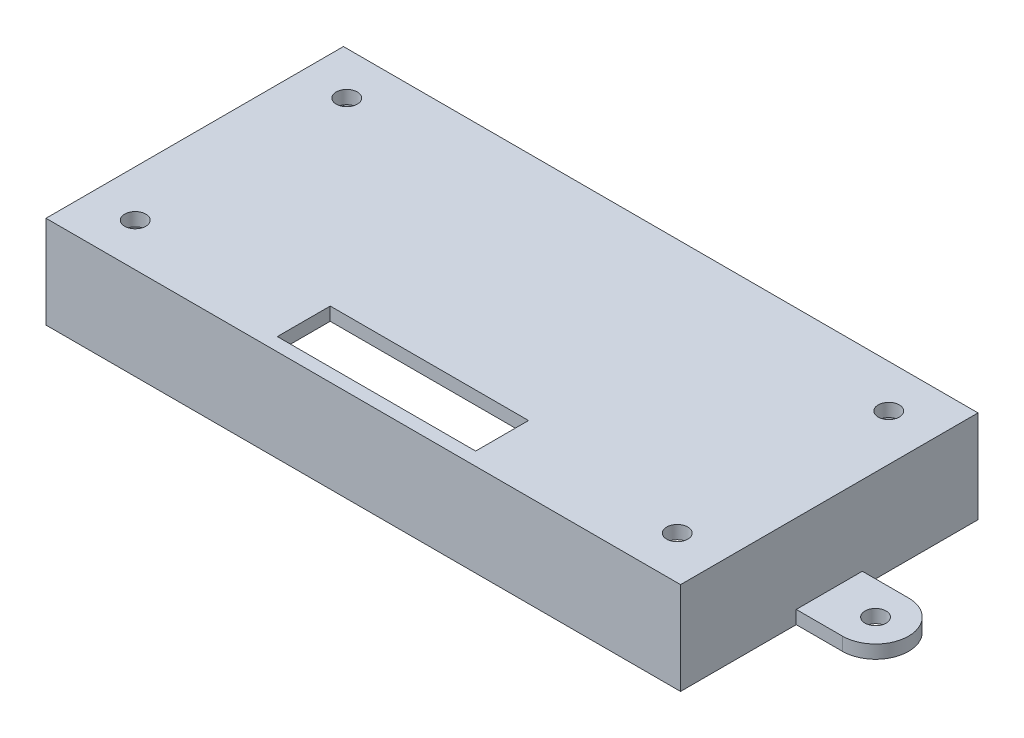
ISO-10303-21;
HEADER;
FILE_DESCRIPTION(('STEP AP214'),'2;1');
FILE_NAME('part.step','',(''),(''),'','','');
FILE_SCHEMA(('AUTOMOTIVE_DESIGN { 1 0 10303 214 1 1 1 1 }'));
ENDSEC;
DATA;
#1=APPLICATION_CONTEXT('core data for automotive mechanical design processes');
#2=APPLICATION_PROTOCOL_DEFINITION('international standard','automotive_design',2000,#1);
#3=PRODUCT_CONTEXT('',#1,'mechanical');
#4=PRODUCT('Part','Part','',(#3));
#5=PRODUCT_RELATED_PRODUCT_CATEGORY('part','',(#4));
#6=PRODUCT_DEFINITION_FORMATION('','',#4);
#7=PRODUCT_DEFINITION_CONTEXT('part definition',#1,'design');
#8=PRODUCT_DEFINITION('design','',#6,#7);
#9=PRODUCT_DEFINITION_SHAPE('','',#8);
#10=(LENGTH_UNIT() NAMED_UNIT(*) SI_UNIT(.MILLI.,.METRE.));
#11=(NAMED_UNIT(*) PLANE_ANGLE_UNIT() SI_UNIT($,.RADIAN.));
#12=(NAMED_UNIT(*) SI_UNIT($,.STERADIAN.) SOLID_ANGLE_UNIT());
#13=UNCERTAINTY_MEASURE_WITH_UNIT(LENGTH_MEASURE(1.E-05),#10,'distance_accuracy_value','');
#14=(GEOMETRIC_REPRESENTATION_CONTEXT(3) GLOBAL_UNCERTAINTY_ASSIGNED_CONTEXT((#13)) GLOBAL_UNIT_ASSIGNED_CONTEXT((#10,
#11,#12)) REPRESENTATION_CONTEXT('',''));
#15=CARTESIAN_POINT('',(0.,0.,0.));
#16=DIRECTION('',(0.,0.,1.));
#17=DIRECTION('',(1.,0.,0.));
#18=AXIS2_PLACEMENT_3D('',#15,#16,#17);
#19=CARTESIAN_POINT('',(0.,2.,0.));
#20=DIRECTION('',(0.,1.,0.));
#21=DIRECTION('',(0.,0.,1.));
#22=AXIS2_PLACEMENT_3D('',#19,#20,#21);
#23=PLANE('',#22);
#24=DIRECTION('',(0.,0.,1.));
#25=VECTOR('',#24,1.);
#26=CARTESIAN_POINT('',(-48.,2.,-22.5));
#27=LINE('',#26,#25);
#28=CARTESIAN_POINT('',(-48.,2.,-5.));
#29=VERTEX_POINT('',#28);
#30=CARTESIAN_POINT('',(-48.,2.,5.));
#31=VERTEX_POINT('',#30);
#32=EDGE_CURVE('E11',#29,#31,#27,.T.);
#33=ORIENTED_EDGE('',*,*,#32,.F.);
#34=DIRECTION('',(1.,0.,0.));
#35=VECTOR('',#34,1.);
#36=CARTESIAN_POINT('',(0.,2.,-5.00000000000002));
#37=LINE('',#36,#35);
#38=CARTESIAN_POINT('',(-55.,2.,-5.));
#39=VERTEX_POINT('',#38);
#40=EDGE_CURVE('E293',#39,#29,#37,.T.);
#41=ORIENTED_EDGE('',*,*,#40,.F.);
#42=CARTESIAN_POINT('',(-55.,2.,0.));
#43=DIRECTION('',(0.,1.,0.));
#44=DIRECTION('',(0.,0.,1.));
#45=AXIS2_PLACEMENT_3D('',#42,#43,#44);
#46=CIRCLE('',#45,5.);
#47=CARTESIAN_POINT('',(-55.,2.,5.));
#48=VERTEX_POINT('',#47);
#49=EDGE_CURVE('E296',#39,#48,#46,.T.);
#50=ORIENTED_EDGE('',*,*,#49,.T.);
#51=DIRECTION('',(1.,0.,0.));
#52=VECTOR('',#51,1.);
#53=CARTESIAN_POINT('',(0.,2.,5.00000000000002));
#54=LINE('',#53,#52);
#55=EDGE_CURVE('E298',#48,#31,#54,.T.);
#56=ORIENTED_EDGE('',*,*,#55,.T.);
#57=EDGE_LOOP('',(#33,#41,#50,#56));
#58=FACE_BOUND('',#57,.T.);
#59=CARTESIAN_POINT('',(-55.,2.,0.));
#60=DIRECTION('',(0.,1.,0.));
#61=DIRECTION('',(0.,0.,1.));
#62=AXIS2_PLACEMENT_3D('',#59,#60,#61);
#63=CIRCLE('',#62,1.6);
#64=CARTESIAN_POINT('',(-55.,2.,1.6));
#65=VERTEX_POINT('',#64);
#66=EDGE_CURVE('E300',#65,#65,#63,.T.);
#67=ORIENTED_EDGE('',*,*,#66,.F.);
#68=EDGE_LOOP('',(#67));
#69=FACE_BOUND('',#68,.T.);
#70=ADVANCED_FACE('F40',(#58,#69),#23,.T.);
#71=CARTESIAN_POINT('',(0.,2.,22.5));
#72=DIRECTION('',(0.,0.,-1.));
#73=DIRECTION('',(-1.,0.,0.));
#74=AXIS2_PLACEMENT_3D('',#71,#72,#73);
#75=PLANE('',#74);
#76=DIRECTION('',(1.,0.,0.));
#77=VECTOR('',#76,1.);
#78=CARTESIAN_POINT('',(0.,0.,22.5));
#79=LINE('',#78,#77);
#80=CARTESIAN_POINT('',(-48.,0.,22.5));
#81=VERTEX_POINT('',#80);
#82=CARTESIAN_POINT('',(48.,0.,22.5));
#83=VERTEX_POINT('',#82);
#84=EDGE_CURVE('E280',#81,#83,#79,.T.);
#85=ORIENTED_EDGE('',*,*,#84,.T.);
#86=DIRECTION('',(0.,-1.,0.));
#87=VECTOR('',#86,1.);
#88=CARTESIAN_POINT('',(48.,2.,22.5));
#89=LINE('',#88,#87);
#90=CARTESIAN_POINT('',(48.,14.,22.5));
#91=VERTEX_POINT('',#90);
#92=EDGE_CURVE('E44',#91,#83,#89,.T.);
#93=ORIENTED_EDGE('',*,*,#92,.F.);
#94=DIRECTION('',(1.,0.,0.));
#95=VECTOR('',#94,1.);
#96=CARTESIAN_POINT('',(-48.,14.,22.5));
#97=LINE('',#96,#95);
#98=CARTESIAN_POINT('',(-48.,14.,22.5));
#99=VERTEX_POINT('',#98);
#100=EDGE_CURVE('E239',#99,#91,#97,.T.);
#101=ORIENTED_EDGE('',*,*,#100,.F.);
#102=DIRECTION('',(0.,-1.,0.));
#103=VECTOR('',#102,1.);
#104=CARTESIAN_POINT('',(-48.,2.,22.5));
#105=LINE('',#104,#103);
#106=EDGE_CURVE('E306',#99,#81,#105,.T.);
#107=ORIENTED_EDGE('',*,*,#106,.T.);
#108=EDGE_LOOP('',(#85,#93,#101,#107));
#109=FACE_BOUND('',#108,.T.);
#110=ADVANCED_FACE('F42',(#109),#75,.F.);
#111=CARTESIAN_POINT('',(0.,2.,5.00000000000011));
#112=DIRECTION('',(0.,0.,1.));
#113=DIRECTION('',(1.,0.,0.));
#114=AXIS2_PLACEMENT_3D('',#111,#112,#113);
#115=PLANE('',#114);
#116=DIRECTION('',(-1.,0.,0.));
#117=VECTOR('',#116,1.);
#118=CARTESIAN_POINT('',(0.,0.,5.00000000000011));
#119=LINE('',#118,#117);
#120=CARTESIAN_POINT('',(55.,0.,5.));
#121=VERTEX_POINT('',#120);
#122=CARTESIAN_POINT('',(48.,0.,5.));
#123=VERTEX_POINT('',#122);
#124=EDGE_CURVE('E312',#121,#123,#119,.T.);
#125=ORIENTED_EDGE('',*,*,#124,.F.);
#126=DIRECTION('',(0.,-1.,0.));
#127=VECTOR('',#126,1.);
#128=CARTESIAN_POINT('',(55.,2.,5.));
#129=LINE('',#128,#127);
#130=CARTESIAN_POINT('',(55.,2.,5.));
#131=VERTEX_POINT('',#130);
#132=EDGE_CURVE('E360',#131,#121,#129,.T.);
#133=ORIENTED_EDGE('',*,*,#132,.F.);
#134=DIRECTION('',(-1.,0.,0.));
#135=VECTOR('',#134,1.);
#136=CARTESIAN_POINT('',(0.,2.,5.00000000000011));
#137=LINE('',#136,#135);
#138=CARTESIAN_POINT('',(48.,2.,5.));
#139=VERTEX_POINT('',#138);
#140=EDGE_CURVE('E284',#131,#139,#137,.T.);
#141=ORIENTED_EDGE('',*,*,#140,.T.);
#142=DIRECTION('',(0.,-1.,0.));
#143=VECTOR('',#142,1.);
#144=CARTESIAN_POINT('',(48.,2.,5.));
#145=LINE('',#144,#143);
#146=EDGE_CURVE('E361',#139,#123,#145,.T.);
#147=ORIENTED_EDGE('',*,*,#146,.T.);
#148=EDGE_LOOP('',(#125,#133,#141,#147));
#149=FACE_BOUND('',#148,.T.);
#150=ADVANCED_FACE('F411',(#149),#115,.T.);
#151=CARTESIAN_POINT('',(55.,2.,0.));
#152=DIRECTION('',(0.,-1.,0.));
#153=DIRECTION('',(0.,0.,-1.));
#154=AXIS2_PLACEMENT_3D('',#151,#152,#153);
#155=CYLINDRICAL_SURFACE('',#154,5.);
#156=CARTESIAN_POINT('',(55.,0.,0.));
#157=DIRECTION('',(0.,1.,0.));
#158=DIRECTION('',(0.,0.,1.));
#159=AXIS2_PLACEMENT_3D('',#156,#157,#158);
#160=CIRCLE('',#159,5.);
#161=CARTESIAN_POINT('',(55.,0.,-5.));
#162=VERTEX_POINT('',#161);
#163=EDGE_CURVE('E316',#162,#121,#160,.F.);
#164=ORIENTED_EDGE('',*,*,#163,.F.);
#165=DIRECTION('',(0.,-1.,0.));
#166=VECTOR('',#165,1.);
#167=CARTESIAN_POINT('',(55.,2.,-5.));
#168=LINE('',#167,#166);
#169=CARTESIAN_POINT('',(55.,2.,-5.));
#170=VERTEX_POINT('',#169);
#171=EDGE_CURVE('E358',#170,#162,#168,.T.);
#172=ORIENTED_EDGE('',*,*,#171,.F.);
#173=CARTESIAN_POINT('',(55.,2.,0.));
#174=DIRECTION('',(0.,1.,0.));
#175=DIRECTION('',(0.,0.,1.));
#176=AXIS2_PLACEMENT_3D('',#173,#174,#175);
#177=CIRCLE('',#176,5.);
#178=EDGE_CURVE('E287',#170,#131,#177,.F.);
#179=ORIENTED_EDGE('',*,*,#178,.T.);
#180=ORIENTED_EDGE('',*,*,#132,.T.);
#181=EDGE_LOOP('',(#164,#172,#179,#180));
#182=FACE_BOUND('',#181,.T.);
#183=ADVANCED_FACE('F409',(#182),#155,.T.);
#184=CARTESIAN_POINT('',(0.,2.,-5.00000000000011));
#185=DIRECTION('',(0.,0.,1.));
#186=DIRECTION('',(1.,0.,0.));
#187=AXIS2_PLACEMENT_3D('',#184,#185,#186);
#188=PLANE('',#187);
#189=DIRECTION('',(-1.,0.,0.));
#190=VECTOR('',#189,1.);
#191=CARTESIAN_POINT('',(0.,0.,-5.00000000000011));
#192=LINE('',#191,#190);
#193=CARTESIAN_POINT('',(48.,0.,-5.));
#194=VERTEX_POINT('',#193);
#195=EDGE_CURVE('E319',#162,#194,#192,.T.);
#196=ORIENTED_EDGE('',*,*,#195,.T.);
#197=DIRECTION('',(0.,-1.,0.));
#198=VECTOR('',#197,1.);
#199=CARTESIAN_POINT('',(48.,2.,-5.));
#200=LINE('',#199,#198);
#201=CARTESIAN_POINT('',(48.,2.,-5.));
#202=VERTEX_POINT('',#201);
#203=EDGE_CURVE('E355',#202,#194,#200,.T.);
#204=ORIENTED_EDGE('',*,*,#203,.F.);
#205=DIRECTION('',(-1.,0.,0.));
#206=VECTOR('',#205,1.);
#207=CARTESIAN_POINT('',(0.,2.,-5.00000000000011));
#208=LINE('',#207,#206);
#209=EDGE_CURVE('E291',#170,#202,#208,.T.);
#210=ORIENTED_EDGE('',*,*,#209,.F.);
#211=ORIENTED_EDGE('',*,*,#171,.T.);
#212=EDGE_LOOP('',(#196,#204,#210,#211));
#213=FACE_BOUND('',#212,.T.);
#214=ADVANCED_FACE('F405',(#213),#188,.F.);
#215=CARTESIAN_POINT('',(48.,2.,0.));
#216=DIRECTION('',(-1.,0.,0.));
#217=DIRECTION('',(0.,0.,1.));
#218=AXIS2_PLACEMENT_3D('',#215,#216,#217);
#219=PLANE('',#218);
#220=DIRECTION('',(0.,0.,-1.));
#221=VECTOR('',#220,1.);
#222=CARTESIAN_POINT('',(48.,0.,0.));
#223=LINE('',#222,#221);
#224=CARTESIAN_POINT('',(48.,0.,-22.5));
#225=VERTEX_POINT('',#224);
#226=EDGE_CURVE('E313',#194,#225,#223,.T.);
#227=ORIENTED_EDGE('',*,*,#226,.T.);
#228=DIRECTION('',(0.,-1.,0.));
#229=VECTOR('',#228,1.);
#230=CARTESIAN_POINT('',(48.,2.,-22.5));
#231=LINE('',#230,#229);
#232=CARTESIAN_POINT('',(48.,14.,-22.5));
#233=VERTEX_POINT('',#232);
#234=EDGE_CURVE('E353',#233,#225,#231,.T.);
#235=ORIENTED_EDGE('',*,*,#234,.F.);
#236=DIRECTION('',(0.,0.,-1.));
#237=VECTOR('',#236,1.);
#238=CARTESIAN_POINT('',(48.,14.,-22.5));
#239=LINE('',#238,#237);
#240=EDGE_CURVE('E242',#91,#233,#239,.T.);
#241=ORIENTED_EDGE('',*,*,#240,.F.);
#242=ORIENTED_EDGE('',*,*,#92,.T.);
#243=EDGE_CURVE('E309',#83,#123,#223,.T.);
#244=ORIENTED_EDGE('',*,*,#243,.T.);
#245=ORIENTED_EDGE('',*,*,#146,.F.);
#246=DIRECTION('',(0.,0.,-1.));
#247=VECTOR('',#246,1.);
#248=CARTESIAN_POINT('',(48.,2.,-22.5));
#249=LINE('',#248,#247);
#250=EDGE_CURVE('E49',#139,#202,#249,.T.);
#251=ORIENTED_EDGE('',*,*,#250,.T.);
#252=ORIENTED_EDGE('',*,*,#203,.T.);
#253=EDGE_LOOP('',(#227,#235,#241,#242,#244,#245,#251,#252));
#254=FACE_BOUND('',#253,.T.);
#255=ADVANCED_FACE('F369',(#254),#219,.F.);
#256=CARTESIAN_POINT('',(0.,2.,-22.5));
#257=DIRECTION('',(0.,0.,-1.));
#258=DIRECTION('',(-1.,0.,0.));
#259=AXIS2_PLACEMENT_3D('',#256,#257,#258);
#260=PLANE('',#259);
#261=DIRECTION('',(1.,0.,0.));
#262=VECTOR('',#261,1.);
#263=CARTESIAN_POINT('',(0.,0.,-22.5));
#264=LINE('',#263,#262);
#265=CARTESIAN_POINT('',(-48.,0.,-22.5));
#266=VERTEX_POINT('',#265);
#267=EDGE_CURVE('E321',#266,#225,#264,.T.);
#268=ORIENTED_EDGE('',*,*,#267,.F.);
#269=DIRECTION('',(0.,-1.,0.));
#270=VECTOR('',#269,1.);
#271=CARTESIAN_POINT('',(-48.,2.,-22.5));
#272=LINE('',#271,#270);
#273=CARTESIAN_POINT('',(-48.,14.,-22.5));
#274=VERTEX_POINT('',#273);
#275=EDGE_CURVE('E351',#274,#266,#272,.T.);
#276=ORIENTED_EDGE('',*,*,#275,.F.);
#277=DIRECTION('',(-1.,0.,0.));
#278=VECTOR('',#277,1.);
#279=CARTESIAN_POINT('',(-48.,14.,-22.5));
#280=LINE('',#279,#278);
#281=EDGE_CURVE('E245',#233,#274,#280,.T.);
#282=ORIENTED_EDGE('',*,*,#281,.F.);
#283=ORIENTED_EDGE('',*,*,#234,.T.);
#284=EDGE_LOOP('',(#268,#276,#282,#283));
#285=FACE_BOUND('',#284,.T.);
#286=ADVANCED_FACE('F400',(#285),#260,.T.);
#287=CARTESIAN_POINT('',(0.,2.,-5.00000000000002));
#288=DIRECTION('',(0.,0.,-1.));
#289=DIRECTION('',(-1.,0.,0.));
#290=AXIS2_PLACEMENT_3D('',#287,#288,#289);
#291=PLANE('',#290);
#292=DIRECTION('',(1.,0.,0.));
#293=VECTOR('',#292,1.);
#294=CARTESIAN_POINT('',(0.,0.,-5.00000000000002));
#295=LINE('',#294,#293);
#296=CARTESIAN_POINT('',(-55.,0.,-5.));
#297=VERTEX_POINT('',#296);
#298=CARTESIAN_POINT('',(-48.,0.,-5.));
#299=VERTEX_POINT('',#298);
#300=EDGE_CURVE('E327',#297,#299,#295,.T.);
#301=ORIENTED_EDGE('',*,*,#300,.F.);
#302=DIRECTION('',(0.,-1.,0.));
#303=VECTOR('',#302,1.);
#304=CARTESIAN_POINT('',(-55.,2.,-5.));
#305=LINE('',#304,#303);
#306=EDGE_CURVE('E347',#39,#297,#305,.T.);
#307=ORIENTED_EDGE('',*,*,#306,.F.);
#308=ORIENTED_EDGE('',*,*,#40,.T.);
#309=DIRECTION('',(0.,-1.,0.));
#310=VECTOR('',#309,1.);
#311=CARTESIAN_POINT('',(-48.,2.,-5.));
#312=LINE('',#311,#310);
#313=EDGE_CURVE('E349',#29,#299,#312,.T.);
#314=ORIENTED_EDGE('',*,*,#313,.T.);
#315=EDGE_LOOP('',(#301,#307,#308,#314));
#316=FACE_BOUND('',#315,.T.);
#317=ADVANCED_FACE('F392',(#316),#291,.T.);
#318=CARTESIAN_POINT('',(-55.,2.,0.));
#319=DIRECTION('',(0.,-1.,0.));
#320=DIRECTION('',(0.,0.,-1.));
#321=AXIS2_PLACEMENT_3D('',#318,#319,#320);
#322=CYLINDRICAL_SURFACE('',#321,5.);
#323=CARTESIAN_POINT('',(-55.,0.,0.));
#324=DIRECTION('',(0.,1.,0.));
#325=DIRECTION('',(0.,0.,1.));
#326=AXIS2_PLACEMENT_3D('',#323,#324,#325);
#327=CIRCLE('',#326,5.);
#328=CARTESIAN_POINT('',(-55.,0.,5.));
#329=VERTEX_POINT('',#328);
#330=EDGE_CURVE('E331',#297,#329,#327,.T.);
#331=ORIENTED_EDGE('',*,*,#330,.T.);
#332=DIRECTION('',(0.,-1.,0.));
#333=VECTOR('',#332,1.);
#334=CARTESIAN_POINT('',(-55.,2.,5.));
#335=LINE('',#334,#333);
#336=EDGE_CURVE('E344',#48,#329,#335,.T.);
#337=ORIENTED_EDGE('',*,*,#336,.F.);
#338=ORIENTED_EDGE('',*,*,#49,.F.);
#339=ORIENTED_EDGE('',*,*,#306,.T.);
#340=EDGE_LOOP('',(#331,#337,#338,#339));
#341=FACE_BOUND('',#340,.T.);
#342=ADVANCED_FACE('F454',(#341),#322,.T.);
#343=CARTESIAN_POINT('',(0.,2.,5.00000000000002));
#344=DIRECTION('',(0.,0.,-1.));
#345=DIRECTION('',(-1.,0.,0.));
#346=AXIS2_PLACEMENT_3D('',#343,#344,#345);
#347=PLANE('',#346);
#348=DIRECTION('',(1.,0.,0.));
#349=VECTOR('',#348,1.);
#350=CARTESIAN_POINT('',(0.,0.,5.00000000000002));
#351=LINE('',#350,#349);
#352=CARTESIAN_POINT('',(-48.,0.,5.));
#353=VERTEX_POINT('',#352);
#354=EDGE_CURVE('E333',#329,#353,#351,.T.);
#355=ORIENTED_EDGE('',*,*,#354,.T.);
#356=DIRECTION('',(0.,-1.,0.));
#357=VECTOR('',#356,1.);
#358=CARTESIAN_POINT('',(-48.,2.,5.));
#359=LINE('',#358,#357);
#360=EDGE_CURVE('E342',#31,#353,#359,.T.);
#361=ORIENTED_EDGE('',*,*,#360,.F.);
#362=ORIENTED_EDGE('',*,*,#55,.F.);
#363=ORIENTED_EDGE('',*,*,#336,.T.);
#364=EDGE_LOOP('',(#355,#361,#362,#363));
#365=FACE_BOUND('',#364,.T.);
#366=ADVANCED_FACE('F386',(#365),#347,.F.);
#367=CARTESIAN_POINT('',(-55.,2.,0.));
#368=DIRECTION('',(0.,-1.,0.));
#369=DIRECTION('',(0.,0.,-1.));
#370=AXIS2_PLACEMENT_3D('',#367,#368,#369);
#371=CYLINDRICAL_SURFACE('',#370,1.6);
#372=ORIENTED_EDGE('',*,*,#66,.T.);
#373=EDGE_LOOP('',(#372));
#374=FACE_BOUND('',#373,.T.);
#375=CARTESIAN_POINT('',(-55.,0.,0.));
#376=DIRECTION('',(0.,1.,0.));
#377=DIRECTION('',(0.,0.,1.));
#378=AXIS2_PLACEMENT_3D('',#375,#376,#377);
#379=CIRCLE('',#378,1.6);
#380=CARTESIAN_POINT('',(-55.,0.,1.6));
#381=VERTEX_POINT('',#380);
#382=EDGE_CURVE('E336',#381,#381,#379,.T.);
#383=ORIENTED_EDGE('',*,*,#382,.F.);
#384=EDGE_LOOP('',(#383));
#385=FACE_BOUND('',#384,.T.);
#386=ADVANCED_FACE('F446',(#374,#385),#371,.F.);
#387=CARTESIAN_POINT('',(-48.,2.,0.));
#388=DIRECTION('',(-1.,0.,0.));
#389=DIRECTION('',(0.,0.,1.));
#390=AXIS2_PLACEMENT_3D('',#387,#388,#389);
#391=PLANE('',#390);
#392=DIRECTION('',(0.,0.,-1.));
#393=VECTOR('',#392,1.);
#394=CARTESIAN_POINT('',(-48.,0.,0.));
#395=LINE('',#394,#393);
#396=EDGE_CURVE('E328',#81,#353,#395,.T.);
#397=ORIENTED_EDGE('',*,*,#396,.F.);
#398=ORIENTED_EDGE('',*,*,#106,.F.);
#399=DIRECTION('',(0.,0.,1.));
#400=VECTOR('',#399,1.);
#401=CARTESIAN_POINT('',(-48.,14.,-22.5));
#402=LINE('',#401,#400);
#403=EDGE_CURVE('E234',#274,#99,#402,.T.);
#404=ORIENTED_EDGE('',*,*,#403,.F.);
#405=ORIENTED_EDGE('',*,*,#275,.T.);
#406=EDGE_CURVE('E324',#299,#266,#395,.T.);
#407=ORIENTED_EDGE('',*,*,#406,.F.);
#408=ORIENTED_EDGE('',*,*,#313,.F.);
#409=ORIENTED_EDGE('',*,*,#32,.T.);
#410=ORIENTED_EDGE('',*,*,#360,.T.);
#411=EDGE_LOOP('',(#397,#398,#404,#405,#407,#408,#409,#410));
#412=FACE_BOUND('',#411,.T.);
#413=ADVANCED_FACE('F380',(#412),#391,.T.);
#414=CARTESIAN_POINT('',(55.,2.,0.));
#415=DIRECTION('',(0.,-1.,0.));
#416=DIRECTION('',(0.,0.,-1.));
#417=AXIS2_PLACEMENT_3D('',#414,#415,#416);
#418=CYLINDRICAL_SURFACE('',#417,1.6);
#419=CARTESIAN_POINT('',(55.,2.,0.));
#420=DIRECTION('',(0.,1.,0.));
#421=DIRECTION('',(0.,0.,1.));
#422=AXIS2_PLACEMENT_3D('',#419,#420,#421);
#423=CIRCLE('',#422,1.6);
#424=CARTESIAN_POINT('',(55.,2.,1.6));
#425=VERTEX_POINT('',#424);
#426=EDGE_CURVE('E303',#425,#425,#423,.F.);
#427=ORIENTED_EDGE('',*,*,#426,.F.);
#428=EDGE_LOOP('',(#427));
#429=FACE_BOUND('',#428,.T.);
#430=CARTESIAN_POINT('',(55.,0.,0.));
#431=DIRECTION('',(0.,1.,0.));
#432=DIRECTION('',(0.,0.,1.));
#433=AXIS2_PLACEMENT_3D('',#430,#431,#432);
#434=CIRCLE('',#433,1.6);
#435=CARTESIAN_POINT('',(55.,0.,1.6));
#436=VERTEX_POINT('',#435);
#437=EDGE_CURVE('E288',#436,#436,#434,.F.);
#438=ORIENTED_EDGE('',*,*,#437,.T.);
#439=EDGE_LOOP('',(#438));
#440=FACE_BOUND('',#439,.T.);
#441=ADVANCED_FACE('F428',(#429,#440),#418,.F.);
#442=ORIENTED_EDGE('',*,*,#250,.F.);
#443=ORIENTED_EDGE('',*,*,#140,.F.);
#444=ORIENTED_EDGE('',*,*,#178,.F.);
#445=ORIENTED_EDGE('',*,*,#209,.T.);
#446=EDGE_LOOP('',(#442,#443,#444,#445));
#447=FACE_BOUND('',#446,.T.);
#448=ORIENTED_EDGE('',*,*,#426,.T.);
#449=EDGE_LOOP('',(#448));
#450=FACE_BOUND('',#449,.T.);
#451=ADVANCED_FACE('F421',(#447,#450),#23,.T.);
#452=CARTESIAN_POINT('',(0.,0.,0.));
#453=DIRECTION('',(0.,1.,0.));
#454=DIRECTION('',(0.,0.,1.));
#455=AXIS2_PLACEMENT_3D('',#452,#453,#454);
#456=PLANE('',#455);
#457=DIRECTION('',(-1.,0.,0.));
#458=VECTOR('',#457,1.);
#459=CARTESIAN_POINT('',(-46.,0.,-20.5));
#460=LINE('',#459,#458);
#461=CARTESIAN_POINT('',(46.,0.,-20.5));
#462=VERTEX_POINT('',#461);
#463=CARTESIAN_POINT('',(-46.,0.,-20.5));
#464=VERTEX_POINT('',#463);
#465=EDGE_CURVE('E257',#462,#464,#460,.T.);
#466=ORIENTED_EDGE('',*,*,#465,.T.);
#467=DIRECTION('',(0.,0.,1.));
#468=VECTOR('',#467,1.);
#469=CARTESIAN_POINT('',(-46.,0.,20.5));
#470=LINE('',#469,#468);
#471=CARTESIAN_POINT('',(-46.,0.,20.5));
#472=VERTEX_POINT('',#471);
#473=EDGE_CURVE('E248',#464,#472,#470,.T.);
#474=ORIENTED_EDGE('',*,*,#473,.T.);
#475=DIRECTION('',(1.,0.,0.));
#476=VECTOR('',#475,1.);
#477=CARTESIAN_POINT('',(-46.,0.,20.5));
#478=LINE('',#477,#476);
#479=CARTESIAN_POINT('',(46.,0.,20.5));
#480=VERTEX_POINT('',#479);
#481=EDGE_CURVE('E251',#472,#480,#478,.T.);
#482=ORIENTED_EDGE('',*,*,#481,.T.);
#483=DIRECTION('',(0.,0.,-1.));
#484=VECTOR('',#483,1.);
#485=CARTESIAN_POINT('',(46.,0.,20.5));
#486=LINE('',#485,#484);
#487=EDGE_CURVE('E254',#480,#462,#486,.T.);
#488=ORIENTED_EDGE('',*,*,#487,.T.);
#489=EDGE_LOOP('',(#466,#474,#482,#488));
#490=FACE_BOUND('',#489,.T.);
#491=ORIENTED_EDGE('',*,*,#84,.F.);
#492=ORIENTED_EDGE('',*,*,#396,.T.);
#493=ORIENTED_EDGE('',*,*,#354,.F.);
#494=ORIENTED_EDGE('',*,*,#330,.F.);
#495=ORIENTED_EDGE('',*,*,#300,.T.);
#496=ORIENTED_EDGE('',*,*,#406,.T.);
#497=ORIENTED_EDGE('',*,*,#267,.T.);
#498=ORIENTED_EDGE('',*,*,#226,.F.);
#499=ORIENTED_EDGE('',*,*,#195,.F.);
#500=ORIENTED_EDGE('',*,*,#163,.T.);
#501=ORIENTED_EDGE('',*,*,#124,.T.);
#502=ORIENTED_EDGE('',*,*,#243,.F.);
#503=EDGE_LOOP('',(#491,#492,#493,#494,#495,#496,#497,#498,#499,#500,#501,#502));
#504=FACE_BOUND('',#503,.T.);
#505=ORIENTED_EDGE('',*,*,#382,.T.);
#506=EDGE_LOOP('',(#505));
#507=FACE_BOUND('',#506,.T.);
#508=ORIENTED_EDGE('',*,*,#437,.F.);
#509=EDGE_LOOP('',(#508));
#510=FACE_BOUND('',#509,.T.);
#511=ADVANCED_FACE('F376',(#490,#504,#507,#510),#456,.F.);
#512=CARTESIAN_POINT('',(-46.,12.,-20.5));
#513=DIRECTION('',(0.,0.,1.));
#514=DIRECTION('',(1.,0.,0.));
#515=AXIS2_PLACEMENT_3D('',#512,#513,#514);
#516=PLANE('',#515);
#517=DIRECTION('',(0.,-1.,0.));
#518=VECTOR('',#517,1.);
#519=CARTESIAN_POINT('',(-46.,12.,-20.5));
#520=LINE('',#519,#518);
#521=CARTESIAN_POINT('',(-46.,12.,-20.5));
#522=VERTEX_POINT('',#521);
#523=EDGE_CURVE('E279',#522,#464,#520,.T.);
#524=ORIENTED_EDGE('',*,*,#523,.T.);
#525=ORIENTED_EDGE('',*,*,#465,.F.);
#526=DIRECTION('',(0.,-1.,0.));
#527=VECTOR('',#526,1.);
#528=CARTESIAN_POINT('',(46.,12.,-20.5));
#529=LINE('',#528,#527);
#530=CARTESIAN_POINT('',(46.,12.,-20.5));
#531=VERTEX_POINT('',#530);
#532=EDGE_CURVE('E273',#531,#462,#529,.T.);
#533=ORIENTED_EDGE('',*,*,#532,.F.);
#534=DIRECTION('',(-1.,0.,0.));
#535=VECTOR('',#534,1.);
#536=CARTESIAN_POINT('',(-46.,12.,-20.5));
#537=LINE('',#536,#535);
#538=EDGE_CURVE('E260',#531,#522,#537,.T.);
#539=ORIENTED_EDGE('',*,*,#538,.T.);
#540=EDGE_LOOP('',(#524,#525,#533,#539));
#541=FACE_BOUND('',#540,.T.);
#542=ADVANCED_FACE('F434',(#541),#516,.T.);
#543=CARTESIAN_POINT('',(-46.,12.,-20.5));
#544=DIRECTION('',(1.,0.,0.));
#545=DIRECTION('',(0.,0.,-1.));
#546=AXIS2_PLACEMENT_3D('',#543,#544,#545);
#547=PLANE('',#546);
#548=DIRECTION('',(0.,-1.,0.));
#549=VECTOR('',#548,1.);
#550=CARTESIAN_POINT('',(-46.,12.,20.5));
#551=LINE('',#550,#549);
#552=CARTESIAN_POINT('',(-46.,12.,20.5));
#553=VERTEX_POINT('',#552);
#554=EDGE_CURVE('E277',#553,#472,#551,.T.);
#555=ORIENTED_EDGE('',*,*,#554,.T.);
#556=ORIENTED_EDGE('',*,*,#473,.F.);
#557=ORIENTED_EDGE('',*,*,#523,.F.);
#558=DIRECTION('',(0.,0.,1.));
#559=VECTOR('',#558,1.);
#560=CARTESIAN_POINT('',(-46.,12.,-20.5));
#561=LINE('',#560,#559);
#562=EDGE_CURVE('E263',#522,#553,#561,.T.);
#563=ORIENTED_EDGE('',*,*,#562,.T.);
#564=EDGE_LOOP('',(#555,#556,#557,#563));
#565=FACE_BOUND('',#564,.T.);
#566=ADVANCED_FACE('F508',(#565),#547,.T.);
#567=CARTESIAN_POINT('',(-46.,12.,20.5));
#568=DIRECTION('',(0.,0.,-1.));
#569=DIRECTION('',(-1.,0.,0.));
#570=AXIS2_PLACEMENT_3D('',#567,#568,#569);
#571=PLANE('',#570);
#572=DIRECTION('',(0.,-1.,0.));
#573=VECTOR('',#572,1.);
#574=CARTESIAN_POINT('',(46.,12.,20.5));
#575=LINE('',#574,#573);
#576=CARTESIAN_POINT('',(46.,12.,20.5));
#577=VERTEX_POINT('',#576);
#578=EDGE_CURVE('E275',#577,#480,#575,.T.);
#579=ORIENTED_EDGE('',*,*,#578,.T.);
#580=ORIENTED_EDGE('',*,*,#481,.F.);
#581=ORIENTED_EDGE('',*,*,#554,.F.);
#582=DIRECTION('',(1.,0.,0.));
#583=VECTOR('',#582,1.);
#584=CARTESIAN_POINT('',(-46.,12.,20.5));
#585=LINE('',#584,#583);
#586=CARTESIAN_POINT('',(-15.,12.,20.5));
#587=VERTEX_POINT('',#586);
#588=EDGE_CURVE('E267',#553,#587,#585,.T.);
#589=ORIENTED_EDGE('',*,*,#588,.T.);
#590=DIRECTION('',(0.,-1.,0.));
#591=VECTOR('',#590,1.);
#592=CARTESIAN_POINT('',(-15.,14.,20.5));
#593=LINE('',#592,#591);
#594=CARTESIAN_POINT('',(-15.,14.,20.5));
#595=VERTEX_POINT('',#594);
#596=EDGE_CURVE('E207',#595,#587,#593,.T.);
#597=ORIENTED_EDGE('',*,*,#596,.F.);
#598=DIRECTION('',(-1.,0.,0.));
#599=VECTOR('',#598,1.);
#600=CARTESIAN_POINT('',(-15.,14.,20.5));
#601=LINE('',#600,#599);
#602=CARTESIAN_POINT('',(15.,14.,20.5));
#603=VERTEX_POINT('',#602);
#604=EDGE_CURVE('E187',#603,#595,#601,.T.);
#605=ORIENTED_EDGE('',*,*,#604,.F.);
#606=DIRECTION('',(0.,-1.,0.));
#607=VECTOR('',#606,1.);
#608=CARTESIAN_POINT('',(15.,14.,20.5));
#609=LINE('',#608,#607);
#610=CARTESIAN_POINT('',(15.,12.,20.5));
#611=VERTEX_POINT('',#610);
#612=EDGE_CURVE('E210',#603,#611,#609,.T.);
#613=ORIENTED_EDGE('',*,*,#612,.T.);
#614=EDGE_CURVE('E266',#611,#577,#585,.T.);
#615=ORIENTED_EDGE('',*,*,#614,.T.);
#616=EDGE_LOOP('',(#579,#580,#581,#589,#597,#605,#613,#615));
#617=FACE_BOUND('',#616,.T.);
#618=ADVANCED_FACE('F519',(#617),#571,.T.);
#619=CARTESIAN_POINT('',(46.,12.,-20.5));
#620=DIRECTION('',(-1.,0.,0.));
#621=DIRECTION('',(0.,0.,1.));
#622=AXIS2_PLACEMENT_3D('',#619,#620,#621);
#623=PLANE('',#622);
#624=ORIENTED_EDGE('',*,*,#532,.T.);
#625=ORIENTED_EDGE('',*,*,#487,.F.);
#626=ORIENTED_EDGE('',*,*,#578,.F.);
#627=DIRECTION('',(0.,0.,-1.));
#628=VECTOR('',#627,1.);
#629=CARTESIAN_POINT('',(46.,12.,-20.5));
#630=LINE('',#629,#628);
#631=EDGE_CURVE('E270',#577,#531,#630,.T.);
#632=ORIENTED_EDGE('',*,*,#631,.T.);
#633=EDGE_LOOP('',(#624,#625,#626,#632));
#634=FACE_BOUND('',#633,.T.);
#635=ADVANCED_FACE('F528',(#634),#623,.T.);
#636=CARTESIAN_POINT('',(0.,12.,0.));
#637=DIRECTION('',(0.,1.,0.));
#638=DIRECTION('',(0.,0.,1.));
#639=AXIS2_PLACEMENT_3D('',#636,#637,#638);
#640=PLANE('',#639);
#641=CARTESIAN_POINT('',(41.,12.,16.));
#642=DIRECTION('',(0.,-1.,0.));
#643=DIRECTION('',(0.,0.,-1.));
#644=AXIS2_PLACEMENT_3D('',#641,#642,#643);
#645=CIRCLE('',#644,1.6);
#646=CARTESIAN_POINT('',(41.,12.,14.4));
#647=VERTEX_POINT('',#646);
#648=EDGE_CURVE('E209',#647,#647,#645,.T.);
#649=ORIENTED_EDGE('',*,*,#648,.F.);
#650=EDGE_LOOP('',(#649));
#651=FACE_BOUND('',#650,.T.);
#652=CARTESIAN_POINT('',(41.,12.,-16.));
#653=DIRECTION('',(0.,-1.,0.));
#654=DIRECTION('',(0.,0.,-1.));
#655=AXIS2_PLACEMENT_3D('',#652,#653,#654);
#656=CIRCLE('',#655,1.6);
#657=CARTESIAN_POINT('',(41.,12.,-17.6));
#658=VERTEX_POINT('',#657);
#659=EDGE_CURVE('E223',#658,#658,#656,.T.);
#660=ORIENTED_EDGE('',*,*,#659,.F.);
#661=EDGE_LOOP('',(#660));
#662=FACE_BOUND('',#661,.T.);
#663=CARTESIAN_POINT('',(-41.,12.,-16.));
#664=DIRECTION('',(0.,-1.,0.));
#665=DIRECTION('',(0.,0.,-1.));
#666=AXIS2_PLACEMENT_3D('',#663,#664,#665);
#667=CIRCLE('',#666,1.6);
#668=CARTESIAN_POINT('',(-41.,12.,-17.6));
#669=VERTEX_POINT('',#668);
#670=EDGE_CURVE('E217',#669,#669,#667,.T.);
#671=ORIENTED_EDGE('',*,*,#670,.F.);
#672=EDGE_LOOP('',(#671));
#673=FACE_BOUND('',#672,.T.);
#674=CARTESIAN_POINT('',(-41.,12.,16.));
#675=DIRECTION('',(0.,-1.,0.));
#676=DIRECTION('',(0.,0.,-1.));
#677=AXIS2_PLACEMENT_3D('',#674,#675,#676);
#678=CIRCLE('',#677,1.6);
#679=CARTESIAN_POINT('',(-41.,12.,14.4));
#680=VERTEX_POINT('',#679);
#681=EDGE_CURVE('E216',#680,#680,#678,.T.);
#682=ORIENTED_EDGE('',*,*,#681,.F.);
#683=EDGE_LOOP('',(#682));
#684=FACE_BOUND('',#683,.T.);
#685=DIRECTION('',(1.,0.,0.));
#686=VECTOR('',#685,1.);
#687=CARTESIAN_POINT('',(-15.,12.,12.5));
#688=LINE('',#687,#686);
#689=CARTESIAN_POINT('',(-15.,12.,12.5));
#690=VERTEX_POINT('',#689);
#691=CARTESIAN_POINT('',(15.,12.,12.5));
#692=VERTEX_POINT('',#691);
#693=EDGE_CURVE('E200',#690,#692,#688,.T.);
#694=ORIENTED_EDGE('',*,*,#693,.F.);
#695=DIRECTION('',(0.,0.,-1.));
#696=VECTOR('',#695,1.);
#697=CARTESIAN_POINT('',(-15.,12.,20.5));
#698=LINE('',#697,#696);
#699=EDGE_CURVE('E57',#587,#690,#698,.T.);
#700=ORIENTED_EDGE('',*,*,#699,.F.);
#701=ORIENTED_EDGE('',*,*,#588,.F.);
#702=ORIENTED_EDGE('',*,*,#562,.F.);
#703=ORIENTED_EDGE('',*,*,#538,.F.);
#704=ORIENTED_EDGE('',*,*,#631,.F.);
#705=ORIENTED_EDGE('',*,*,#614,.F.);
#706=DIRECTION('',(0.,0.,1.));
#707=VECTOR('',#706,1.);
#708=CARTESIAN_POINT('',(15.,12.,20.5));
#709=LINE('',#708,#707);
#710=EDGE_CURVE('E197',#692,#611,#709,.T.);
#711=ORIENTED_EDGE('',*,*,#710,.F.);
#712=EDGE_LOOP('',(#694,#700,#701,#702,#703,#704,#705,#711));
#713=FACE_BOUND('',#712,.T.);
#714=ADVANCED_FACE('F533',(#651,#662,#673,#684,#713),#640,.F.);
#715=CARTESIAN_POINT('',(0.,14.,0.));
#716=DIRECTION('',(0.,1.,0.));
#717=DIRECTION('',(0.,0.,1.));
#718=AXIS2_PLACEMENT_3D('',#715,#716,#717);
#719=PLANE('',#718);
#720=DIRECTION('',(0.,0.,-1.));
#721=VECTOR('',#720,1.);
#722=CARTESIAN_POINT('',(-15.,14.,20.5));
#723=LINE('',#722,#721);
#724=CARTESIAN_POINT('',(-15.,14.,12.5));
#725=VERTEX_POINT('',#724);
#726=EDGE_CURVE('E181',#595,#725,#723,.T.);
#727=ORIENTED_EDGE('',*,*,#726,.T.);
#728=DIRECTION('',(1.,0.,0.));
#729=VECTOR('',#728,1.);
#730=CARTESIAN_POINT('',(-15.,14.,12.5));
#731=LINE('',#730,#729);
#732=CARTESIAN_POINT('',(15.,14.,12.5));
#733=VERTEX_POINT('',#732);
#734=EDGE_CURVE('E190',#725,#733,#731,.T.);
#735=ORIENTED_EDGE('',*,*,#734,.T.);
#736=DIRECTION('',(0.,0.,1.));
#737=VECTOR('',#736,1.);
#738=CARTESIAN_POINT('',(15.,14.,20.5));
#739=LINE('',#738,#737);
#740=EDGE_CURVE('E65',#733,#603,#739,.T.);
#741=ORIENTED_EDGE('',*,*,#740,.T.);
#742=ORIENTED_EDGE('',*,*,#604,.T.);
#743=EDGE_LOOP('',(#727,#735,#741,#742));
#744=FACE_BOUND('',#743,.T.);
#745=CARTESIAN_POINT('',(41.,14.,16.));
#746=DIRECTION('',(0.,-1.,0.));
#747=DIRECTION('',(0.,0.,-1.));
#748=AXIS2_PLACEMENT_3D('',#745,#746,#747);
#749=CIRCLE('',#748,1.6);
#750=CARTESIAN_POINT('',(41.,14.,14.4));
#751=VERTEX_POINT('',#750);
#752=EDGE_CURVE('E226',#751,#751,#749,.T.);
#753=ORIENTED_EDGE('',*,*,#752,.T.);
#754=EDGE_LOOP('',(#753));
#755=FACE_BOUND('',#754,.T.);
#756=CARTESIAN_POINT('',(41.,14.,-16.));
#757=DIRECTION('',(0.,-1.,0.));
#758=DIRECTION('',(0.,0.,-1.));
#759=AXIS2_PLACEMENT_3D('',#756,#757,#758);
#760=CIRCLE('',#759,1.6);
#761=CARTESIAN_POINT('',(41.,14.,-17.6));
#762=VERTEX_POINT('',#761);
#763=EDGE_CURVE('E220',#762,#762,#760,.T.);
#764=ORIENTED_EDGE('',*,*,#763,.T.);
#765=EDGE_LOOP('',(#764));
#766=FACE_BOUND('',#765,.T.);
#767=CARTESIAN_POINT('',(-41.,14.,-16.));
#768=DIRECTION('',(0.,-1.,0.));
#769=DIRECTION('',(0.,0.,-1.));
#770=AXIS2_PLACEMENT_3D('',#767,#768,#769);
#771=CIRCLE('',#770,1.6);
#772=CARTESIAN_POINT('',(-41.,14.,-17.6));
#773=VERTEX_POINT('',#772);
#774=EDGE_CURVE('E213',#773,#773,#771,.T.);
#775=ORIENTED_EDGE('',*,*,#774,.T.);
#776=EDGE_LOOP('',(#775));
#777=FACE_BOUND('',#776,.T.);
#778=CARTESIAN_POINT('',(-41.,14.,16.));
#779=DIRECTION('',(0.,-1.,0.));
#780=DIRECTION('',(0.,0.,-1.));
#781=AXIS2_PLACEMENT_3D('',#778,#779,#780);
#782=CIRCLE('',#781,1.6);
#783=CARTESIAN_POINT('',(-41.,14.,14.4));
#784=VERTEX_POINT('',#783);
#785=EDGE_CURVE('E231',#784,#784,#782,.T.);
#786=ORIENTED_EDGE('',*,*,#785,.T.);
#787=EDGE_LOOP('',(#786));
#788=FACE_BOUND('',#787,.T.);
#789=ORIENTED_EDGE('',*,*,#403,.T.);
#790=ORIENTED_EDGE('',*,*,#100,.T.);
#791=ORIENTED_EDGE('',*,*,#240,.T.);
#792=ORIENTED_EDGE('',*,*,#281,.T.);
#793=EDGE_LOOP('',(#789,#790,#791,#792));
#794=FACE_BOUND('',#793,.T.);
#795=ADVANCED_FACE('F194',(#744,#755,#766,#777,#788,#794),#719,.T.);
#796=CARTESIAN_POINT('',(-41.,14.,16.));
#797=DIRECTION('',(0.,-1.,0.));
#798=DIRECTION('',(0.,0.,-1.));
#799=AXIS2_PLACEMENT_3D('',#796,#797,#798);
#800=CYLINDRICAL_SURFACE('',#799,1.6);
#801=ORIENTED_EDGE('',*,*,#785,.F.);
#802=EDGE_LOOP('',(#801));
#803=FACE_BOUND('',#802,.T.);
#804=ORIENTED_EDGE('',*,*,#681,.T.);
#805=EDGE_LOOP('',(#804));
#806=FACE_BOUND('',#805,.T.);
#807=ADVANCED_FACE('F541',(#803,#806),#800,.F.);
#808=CARTESIAN_POINT('',(-41.,14.,-16.));
#809=DIRECTION('',(0.,-1.,0.));
#810=DIRECTION('',(0.,0.,-1.));
#811=AXIS2_PLACEMENT_3D('',#808,#809,#810);
#812=CYLINDRICAL_SURFACE('',#811,1.6);
#813=ORIENTED_EDGE('',*,*,#774,.F.);
#814=EDGE_LOOP('',(#813));
#815=FACE_BOUND('',#814,.T.);
#816=ORIENTED_EDGE('',*,*,#670,.T.);
#817=EDGE_LOOP('',(#816));
#818=FACE_BOUND('',#817,.T.);
#819=ADVANCED_FACE('F546',(#815,#818),#812,.F.);
#820=CARTESIAN_POINT('',(41.,14.,-16.));
#821=DIRECTION('',(0.,-1.,0.));
#822=DIRECTION('',(0.,0.,-1.));
#823=AXIS2_PLACEMENT_3D('',#820,#821,#822);
#824=CYLINDRICAL_SURFACE('',#823,1.6);
#825=ORIENTED_EDGE('',*,*,#763,.F.);
#826=EDGE_LOOP('',(#825));
#827=FACE_BOUND('',#826,.T.);
#828=ORIENTED_EDGE('',*,*,#659,.T.);
#829=EDGE_LOOP('',(#828));
#830=FACE_BOUND('',#829,.T.);
#831=ADVANCED_FACE('F559',(#827,#830),#824,.F.);
#832=CARTESIAN_POINT('',(41.,14.,16.));
#833=DIRECTION('',(0.,-1.,0.));
#834=DIRECTION('',(0.,0.,-1.));
#835=AXIS2_PLACEMENT_3D('',#832,#833,#834);
#836=CYLINDRICAL_SURFACE('',#835,1.6);
#837=ORIENTED_EDGE('',*,*,#752,.F.);
#838=EDGE_LOOP('',(#837));
#839=FACE_BOUND('',#838,.T.);
#840=ORIENTED_EDGE('',*,*,#648,.T.);
#841=EDGE_LOOP('',(#840));
#842=FACE_BOUND('',#841,.T.);
#843=ADVANCED_FACE('F570',(#839,#842),#836,.F.);
#844=CARTESIAN_POINT('',(-15.,14.,20.5));
#845=DIRECTION('',(-1.,0.,0.));
#846=DIRECTION('',(0.,0.,1.));
#847=AXIS2_PLACEMENT_3D('',#844,#845,#846);
#848=PLANE('',#847);
#849=ORIENTED_EDGE('',*,*,#699,.T.);
#850=DIRECTION('',(0.,-1.,0.));
#851=VECTOR('',#850,1.);
#852=CARTESIAN_POINT('',(-15.,14.,12.5));
#853=LINE('',#852,#851);
#854=EDGE_CURVE('E177',#725,#690,#853,.T.);
#855=ORIENTED_EDGE('',*,*,#854,.F.);
#856=ORIENTED_EDGE('',*,*,#726,.F.);
#857=ORIENTED_EDGE('',*,*,#596,.T.);
#858=EDGE_LOOP('',(#849,#855,#856,#857));
#859=FACE_BOUND('',#858,.T.);
#860=ADVANCED_FACE('F179',(#859),#848,.F.);
#861=CARTESIAN_POINT('',(15.,14.,20.5));
#862=DIRECTION('',(1.,0.,0.));
#863=DIRECTION('',(0.,0.,-1.));
#864=AXIS2_PLACEMENT_3D('',#861,#862,#863);
#865=PLANE('',#864);
#866=ORIENTED_EDGE('',*,*,#710,.T.);
#867=ORIENTED_EDGE('',*,*,#612,.F.);
#868=ORIENTED_EDGE('',*,*,#740,.F.);
#869=DIRECTION('',(0.,-1.,0.));
#870=VECTOR('',#869,1.);
#871=CARTESIAN_POINT('',(15.,14.,12.5));
#872=LINE('',#871,#870);
#873=EDGE_CURVE('E186',#733,#692,#872,.T.);
#874=ORIENTED_EDGE('',*,*,#873,.T.);
#875=EDGE_LOOP('',(#866,#867,#868,#874));
#876=FACE_BOUND('',#875,.T.);
#877=ADVANCED_FACE('F614',(#876),#865,.F.);
#878=CARTESIAN_POINT('',(-15.,14.,12.5));
#879=DIRECTION('',(0.,0.,-1.));
#880=DIRECTION('',(-1.,0.,0.));
#881=AXIS2_PLACEMENT_3D('',#878,#879,#880);
#882=PLANE('',#881);
#883=ORIENTED_EDGE('',*,*,#693,.T.);
#884=ORIENTED_EDGE('',*,*,#873,.F.);
#885=ORIENTED_EDGE('',*,*,#734,.F.);
#886=ORIENTED_EDGE('',*,*,#854,.T.);
#887=EDGE_LOOP('',(#883,#884,#885,#886));
#888=FACE_BOUND('',#887,.T.);
#889=ADVANCED_FACE('F191',(#888),#882,.F.);
#890=CLOSED_SHELL('',(#70,#110,#150,#183,#214,#255,#286,#317,#342,#366,#386,#413,#441,#451,#511,
#542,#566,#618,#635,#714,#795,#807,#819,#831,#843,#860,#877,#889));
#891=MANIFOLD_SOLID_BREP('B2',#890);
#892=ADVANCED_BREP_SHAPE_REPRESENTATION('',(#18,#891),#14);
#893=SHAPE_DEFINITION_REPRESENTATION(#9,#892);
ENDSEC;
END-ISO-10303-21;
